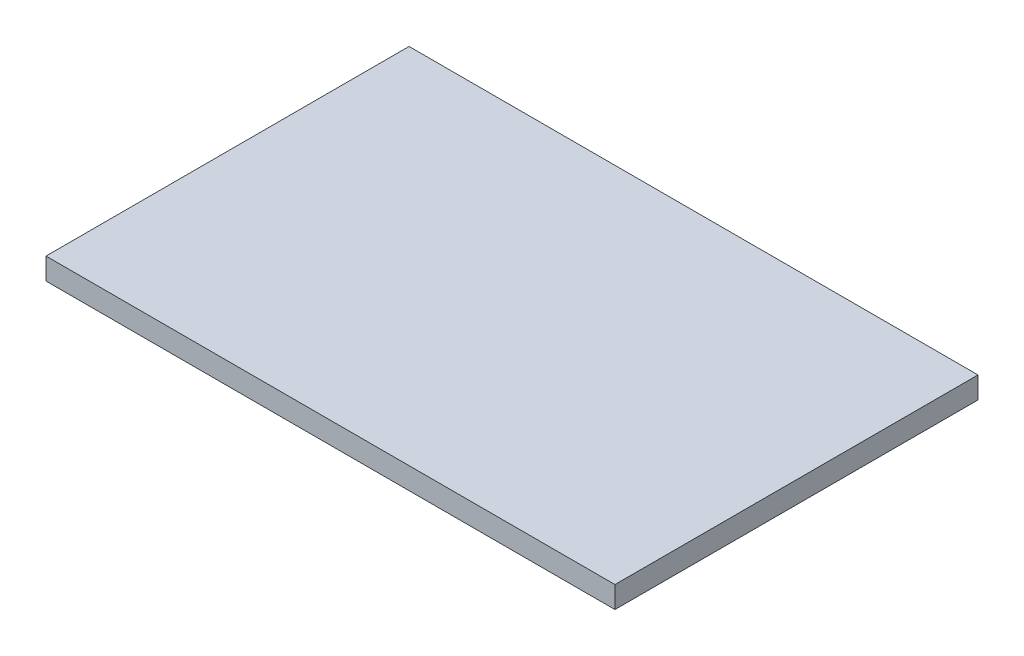
ISO-10303-21;
HEADER;
FILE_DESCRIPTION(('STEP AP214'),'2;1');
FILE_NAME('part.step','',(''),(''),'','','');
FILE_SCHEMA(('AUTOMOTIVE_DESIGN { 1 0 10303 214 1 1 1 1 }'));
ENDSEC;
DATA;
#1=APPLICATION_CONTEXT('core data for automotive mechanical design processes');
#2=APPLICATION_PROTOCOL_DEFINITION('international standard','automotive_design',2000,#1);
#3=PRODUCT_CONTEXT('',#1,'mechanical');
#4=PRODUCT('Part','Part','',(#3));
#5=PRODUCT_RELATED_PRODUCT_CATEGORY('part','',(#4));
#6=PRODUCT_DEFINITION_FORMATION('','',#4);
#7=PRODUCT_DEFINITION_CONTEXT('part definition',#1,'design');
#8=PRODUCT_DEFINITION('design','',#6,#7);
#9=PRODUCT_DEFINITION_SHAPE('','',#8);
#10=(LENGTH_UNIT() NAMED_UNIT(*) SI_UNIT(.MILLI.,.METRE.));
#11=(NAMED_UNIT(*) PLANE_ANGLE_UNIT() SI_UNIT($,.RADIAN.));
#12=(NAMED_UNIT(*) SI_UNIT($,.STERADIAN.) SOLID_ANGLE_UNIT());
#13=UNCERTAINTY_MEASURE_WITH_UNIT(LENGTH_MEASURE(1.E-05),#10,'distance_accuracy_value','');
#14=(GEOMETRIC_REPRESENTATION_CONTEXT(3) GLOBAL_UNCERTAINTY_ASSIGNED_CONTEXT((#13)) GLOBAL_UNIT_ASSIGNED_CONTEXT((#10,
#11,#12)) REPRESENTATION_CONTEXT('',''));
#15=CARTESIAN_POINT('',(0.,0.,0.));
#16=DIRECTION('',(0.,0.,1.));
#17=DIRECTION('',(1.,0.,0.));
#18=AXIS2_PLACEMENT_3D('',#15,#16,#17);
#19=CARTESIAN_POINT('',(0.,4.,0.));
#20=DIRECTION('',(1.,0.,0.));
#21=DIRECTION('',(0.,0.,-1.));
#22=AXIS2_PLACEMENT_3D('',#19,#20,#21);
#23=PLANE('',#22);
#24=DIRECTION('',(0.,0.,1.));
#25=VECTOR('',#24,1.);
#26=CARTESIAN_POINT('',(0.,0.,0.));
#27=LINE('',#26,#25);
#28=CARTESIAN_POINT('',(0.,0.,0.));
#29=VERTEX_POINT('',#28);
#30=CARTESIAN_POINT('',(0.,0.,67.));
#31=VERTEX_POINT('',#30);
#32=EDGE_CURVE('E107',#29,#31,#27,.T.);
#33=ORIENTED_EDGE('',*,*,#32,.T.);
#34=DIRECTION('',(0.,-1.,0.));
#35=VECTOR('',#34,1.);
#36=CARTESIAN_POINT('',(0.,4.,67.));
#37=LINE('',#36,#35);
#38=CARTESIAN_POINT('',(0.,4.,67.));
#39=VERTEX_POINT('',#38);
#40=EDGE_CURVE('E11',#39,#31,#37,.T.);
#41=ORIENTED_EDGE('',*,*,#40,.F.);
#42=DIRECTION('',(0.,0.,1.));
#43=VECTOR('',#42,1.);
#44=CARTESIAN_POINT('',(0.,4.,0.));
#45=LINE('',#44,#43);
#46=CARTESIAN_POINT('',(0.,4.,0.));
#47=VERTEX_POINT('',#46);
#48=EDGE_CURVE('E91',#47,#39,#45,.T.);
#49=ORIENTED_EDGE('',*,*,#48,.F.);
#50=DIRECTION('',(0.,-1.,0.));
#51=VECTOR('',#50,1.);
#52=CARTESIAN_POINT('',(0.,4.,0.));
#53=LINE('',#52,#51);
#54=EDGE_CURVE('E103',#47,#29,#53,.T.);
#55=ORIENTED_EDGE('',*,*,#54,.T.);
#56=EDGE_LOOP('',(#33,#41,#49,#55));
#57=FACE_BOUND('',#56,.T.);
#58=ADVANCED_FACE('F39',(#57),#23,.F.);
#59=CARTESIAN_POINT('',(0.,4.,67.));
#60=DIRECTION('',(0.,0.,-1.));
#61=DIRECTION('',(-1.,0.,0.));
#62=AXIS2_PLACEMENT_3D('',#59,#60,#61);
#63=PLANE('',#62);
#64=DIRECTION('',(1.,0.,0.));
#65=VECTOR('',#64,1.);
#66=CARTESIAN_POINT('',(0.,0.,67.));
#67=LINE('',#66,#65);
#68=CARTESIAN_POINT('',(105.,0.,67.));
#69=VERTEX_POINT('',#68);
#70=EDGE_CURVE('E96',#31,#69,#67,.T.);
#71=ORIENTED_EDGE('',*,*,#70,.T.);
#72=DIRECTION('',(0.,-1.,0.));
#73=VECTOR('',#72,1.);
#74=CARTESIAN_POINT('',(105.,4.,67.));
#75=LINE('',#74,#73);
#76=CARTESIAN_POINT('',(105.,4.,67.));
#77=VERTEX_POINT('',#76);
#78=EDGE_CURVE('E48',#77,#69,#75,.T.);
#79=ORIENTED_EDGE('',*,*,#78,.F.);
#80=DIRECTION('',(1.,0.,0.));
#81=VECTOR('',#80,1.);
#82=CARTESIAN_POINT('',(0.,4.,67.));
#83=LINE('',#82,#81);
#84=EDGE_CURVE('E86',#39,#77,#83,.T.);
#85=ORIENTED_EDGE('',*,*,#84,.F.);
#86=ORIENTED_EDGE('',*,*,#40,.T.);
#87=EDGE_LOOP('',(#71,#79,#85,#86));
#88=FACE_BOUND('',#87,.T.);
#89=ADVANCED_FACE('F95',(#88),#63,.F.);
#90=CARTESIAN_POINT('',(105.,4.,0.));
#91=DIRECTION('',(-1.,0.,0.));
#92=DIRECTION('',(0.,0.,1.));
#93=AXIS2_PLACEMENT_3D('',#90,#91,#92);
#94=PLANE('',#93);
#95=DIRECTION('',(0.,0.,-1.));
#96=VECTOR('',#95,1.);
#97=CARTESIAN_POINT('',(105.,0.,0.));
#98=LINE('',#97,#96);
#99=CARTESIAN_POINT('',(105.,0.,0.));
#100=VERTEX_POINT('',#99);
#101=EDGE_CURVE('E73',#69,#100,#98,.T.);
#102=ORIENTED_EDGE('',*,*,#101,.T.);
#103=DIRECTION('',(0.,-1.,0.));
#104=VECTOR('',#103,1.);
#105=CARTESIAN_POINT('',(105.,4.,0.));
#106=LINE('',#105,#104);
#107=CARTESIAN_POINT('',(105.,4.,0.));
#108=VERTEX_POINT('',#107);
#109=EDGE_CURVE('E98',#108,#100,#106,.T.);
#110=ORIENTED_EDGE('',*,*,#109,.F.);
#111=DIRECTION('',(0.,0.,-1.));
#112=VECTOR('',#111,1.);
#113=CARTESIAN_POINT('',(105.,4.,0.));
#114=LINE('',#113,#112);
#115=EDGE_CURVE('E89',#77,#108,#114,.T.);
#116=ORIENTED_EDGE('',*,*,#115,.F.);
#117=ORIENTED_EDGE('',*,*,#78,.T.);
#118=EDGE_LOOP('',(#102,#110,#116,#117));
#119=FACE_BOUND('',#118,.T.);
#120=ADVANCED_FACE('F99',(#119),#94,.F.);
#121=CARTESIAN_POINT('',(0.,4.,0.));
#122=DIRECTION('',(0.,0.,1.));
#123=DIRECTION('',(1.,0.,0.));
#124=AXIS2_PLACEMENT_3D('',#121,#122,#123);
#125=PLANE('',#124);
#126=DIRECTION('',(-1.,0.,0.));
#127=VECTOR('',#126,1.);
#128=CARTESIAN_POINT('',(0.,0.,0.));
#129=LINE('',#128,#127);
#130=EDGE_CURVE('E79',#100,#29,#129,.T.);
#131=ORIENTED_EDGE('',*,*,#130,.T.);
#132=ORIENTED_EDGE('',*,*,#54,.F.);
#133=DIRECTION('',(-1.,0.,0.));
#134=VECTOR('',#133,1.);
#135=CARTESIAN_POINT('',(0.,4.,0.));
#136=LINE('',#135,#134);
#137=EDGE_CURVE('E56',#108,#47,#136,.T.);
#138=ORIENTED_EDGE('',*,*,#137,.F.);
#139=ORIENTED_EDGE('',*,*,#109,.T.);
#140=EDGE_LOOP('',(#131,#132,#138,#139));
#141=FACE_BOUND('',#140,.T.);
#142=ADVANCED_FACE('F120',(#141),#125,.F.);
#143=CARTESIAN_POINT('',(0.,4.,0.));
#144=DIRECTION('',(0.,1.,0.));
#145=DIRECTION('',(0.,0.,1.));
#146=AXIS2_PLACEMENT_3D('',#143,#144,#145);
#147=PLANE('',#146);
#148=ORIENTED_EDGE('',*,*,#48,.T.);
#149=ORIENTED_EDGE('',*,*,#84,.T.);
#150=ORIENTED_EDGE('',*,*,#115,.T.);
#151=ORIENTED_EDGE('',*,*,#137,.T.);
#152=EDGE_LOOP('',(#148,#149,#150,#151));
#153=FACE_BOUND('',#152,.T.);
#154=ADVANCED_FACE('F87',(#153),#147,.T.);
#155=CARTESIAN_POINT('',(0.,0.,0.));
#156=DIRECTION('',(0.,1.,0.));
#157=DIRECTION('',(0.,0.,1.));
#158=AXIS2_PLACEMENT_3D('',#155,#156,#157);
#159=PLANE('',#158);
#160=ORIENTED_EDGE('',*,*,#32,.F.);
#161=ORIENTED_EDGE('',*,*,#130,.F.);
#162=ORIENTED_EDGE('',*,*,#101,.F.);
#163=ORIENTED_EDGE('',*,*,#70,.F.);
#164=EDGE_LOOP('',(#160,#161,#162,#163));
#165=FACE_BOUND('',#164,.T.);
#166=ADVANCED_FACE('F123',(#165),#159,.F.);
#167=CLOSED_SHELL('',(#58,#89,#120,#142,#154,#166));
#168=MANIFOLD_SOLID_BREP('B2',#167);
#169=ADVANCED_BREP_SHAPE_REPRESENTATION('',(#18,#168),#14);
#170=SHAPE_DEFINITION_REPRESENTATION(#9,#169);
ENDSEC;
END-ISO-10303-21;
